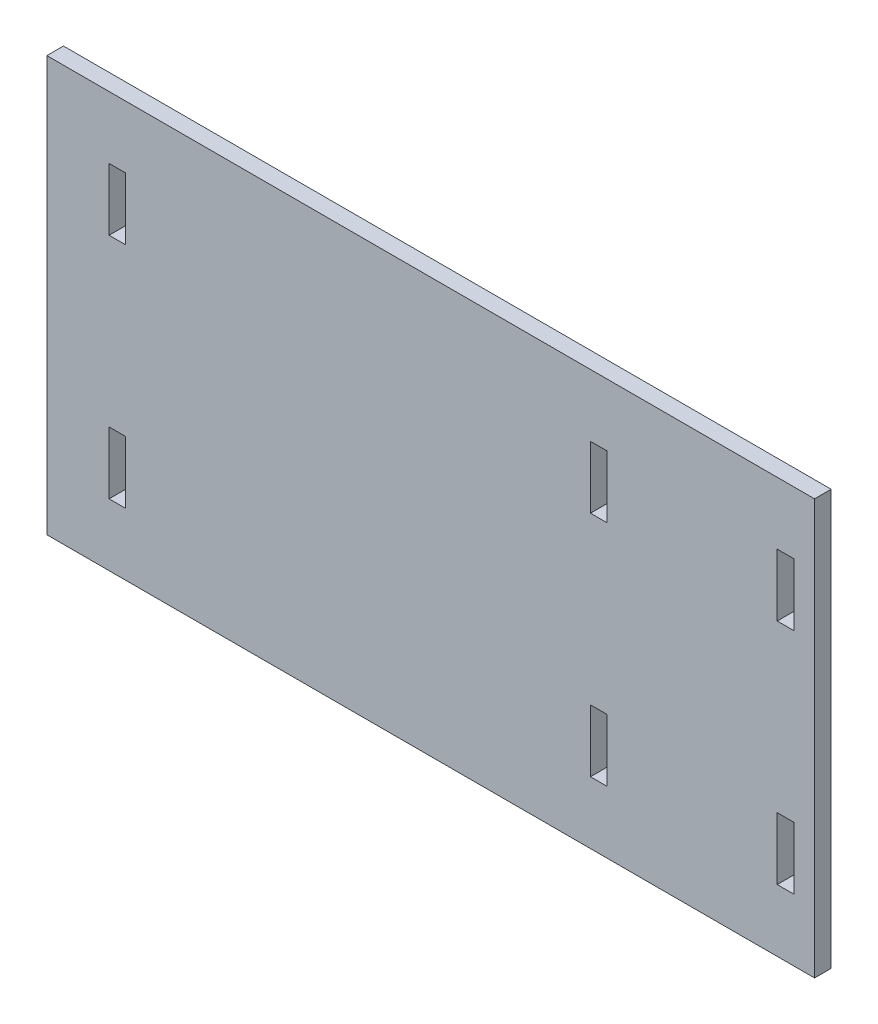
ISO-10303-21;
HEADER;
FILE_DESCRIPTION(('STEP AP214'),'2;1');
FILE_NAME('part.step','',(''),(''),'','','');
FILE_SCHEMA(('AUTOMOTIVE_DESIGN { 1 0 10303 214 1 1 1 1 }'));
ENDSEC;
DATA;
#1=APPLICATION_CONTEXT('core data for automotive mechanical design processes');
#2=APPLICATION_PROTOCOL_DEFINITION('international standard','automotive_design',2000,#1);
#3=PRODUCT_CONTEXT('',#1,'mechanical');
#4=PRODUCT('Part','Part','',(#3));
#5=PRODUCT_RELATED_PRODUCT_CATEGORY('part','',(#4));
#6=PRODUCT_DEFINITION_FORMATION('','',#4);
#7=PRODUCT_DEFINITION_CONTEXT('part definition',#1,'design');
#8=PRODUCT_DEFINITION('design','',#6,#7);
#9=PRODUCT_DEFINITION_SHAPE('','',#8);
#10=(LENGTH_UNIT() NAMED_UNIT(*) SI_UNIT(.MILLI.,.METRE.));
#11=(NAMED_UNIT(*) PLANE_ANGLE_UNIT() SI_UNIT($,.RADIAN.));
#12=(NAMED_UNIT(*) SI_UNIT($,.STERADIAN.) SOLID_ANGLE_UNIT());
#13=UNCERTAINTY_MEASURE_WITH_UNIT(LENGTH_MEASURE(1.E-05),#10,'distance_accuracy_value','');
#14=(GEOMETRIC_REPRESENTATION_CONTEXT(3) GLOBAL_UNCERTAINTY_ASSIGNED_CONTEXT((#13)) GLOBAL_UNIT_ASSIGNED_CONTEXT((#10,
#11,#12)) REPRESENTATION_CONTEXT('',''));
#15=CARTESIAN_POINT('',(0.,0.,0.));
#16=DIRECTION('',(0.,0.,1.));
#17=DIRECTION('',(1.,0.,0.));
#18=AXIS2_PLACEMENT_3D('',#15,#16,#17);
#19=CARTESIAN_POINT('',(0.,0.,4.));
#20=DIRECTION('',(0.,0.,-1.));
#21=DIRECTION('',(-1.,0.,0.));
#22=AXIS2_PLACEMENT_3D('',#19,#20,#21);
#23=PLANE('',#22);
#24=DIRECTION('',(0.,-1.,0.));
#25=VECTOR('',#24,1.);
#26=CARTESIAN_POINT('',(101.,35.,4.));
#27=LINE('',#26,#25);
#28=CARTESIAN_POINT('',(101.,35.,4.));
#29=VERTEX_POINT('',#28);
#30=CARTESIAN_POINT('',(101.,20.,4.));
#31=VERTEX_POINT('',#30);
#32=EDGE_CURVE('E253',#29,#31,#27,.T.);
#33=ORIENTED_EDGE('',*,*,#32,.F.);
#34=DIRECTION('',(-1.,0.,0.));
#35=VECTOR('',#34,1.);
#36=CARTESIAN_POINT('',(101.,35.,4.));
#37=LINE('',#36,#35);
#38=CARTESIAN_POINT('',(105.,35.,4.));
#39=VERTEX_POINT('',#38);
#40=EDGE_CURVE('E261',#39,#29,#37,.T.);
#41=ORIENTED_EDGE('',*,*,#40,.F.);
#42=DIRECTION('',(0.,1.,0.));
#43=VECTOR('',#42,1.);
#44=CARTESIAN_POINT('',(105.,35.,4.));
#45=LINE('',#44,#43);
#46=CARTESIAN_POINT('',(105.,20.,4.));
#47=VERTEX_POINT('',#46);
#48=EDGE_CURVE('E258',#47,#39,#45,.T.);
#49=ORIENTED_EDGE('',*,*,#48,.F.);
#50=DIRECTION('',(1.,0.,0.));
#51=VECTOR('',#50,1.);
#52=CARTESIAN_POINT('',(101.,20.,4.));
#53=LINE('',#52,#51);
#54=EDGE_CURVE('E255',#31,#47,#53,.T.);
#55=ORIENTED_EDGE('',*,*,#54,.F.);
#56=EDGE_LOOP('',(#33,#41,#49,#55));
#57=FACE_BOUND('',#56,.T.);
#58=DIRECTION('',(0.,1.,0.));
#59=VECTOR('',#58,1.);
#60=CARTESIAN_POINT('',(-56.0000000000003,35.,4.));
#61=LINE('',#60,#59);
#62=CARTESIAN_POINT('',(-56.0000000000003,20.,4.));
#63=VERTEX_POINT('',#62);
#64=CARTESIAN_POINT('',(-56.0000000000003,35.,4.));
#65=VERTEX_POINT('',#64);
#66=EDGE_CURVE('E315',#63,#65,#61,.T.);
#67=ORIENTED_EDGE('',*,*,#66,.F.);
#68=DIRECTION('',(1.,0.,0.));
#69=VECTOR('',#68,1.);
#70=CARTESIAN_POINT('',(-56.0000000000003,20.,4.));
#71=LINE('',#70,#69);
#72=CARTESIAN_POINT('',(-60.0000000000003,20.,4.));
#73=VERTEX_POINT('',#72);
#74=EDGE_CURVE('E323',#73,#63,#71,.T.);
#75=ORIENTED_EDGE('',*,*,#74,.F.);
#76=DIRECTION('',(0.,-1.,0.));
#77=VECTOR('',#76,1.);
#78=CARTESIAN_POINT('',(-60.0000000000003,35.,4.));
#79=LINE('',#78,#77);
#80=CARTESIAN_POINT('',(-60.0000000000003,35.,4.));
#81=VERTEX_POINT('',#80);
#82=EDGE_CURVE('E320',#81,#73,#79,.T.);
#83=ORIENTED_EDGE('',*,*,#82,.F.);
#84=DIRECTION('',(-1.,0.,0.));
#85=VECTOR('',#84,1.);
#86=CARTESIAN_POINT('',(-56.0000000000003,35.,4.));
#87=LINE('',#86,#85);
#88=EDGE_CURVE('E317',#65,#81,#87,.T.);
#89=ORIENTED_EDGE('',*,*,#88,.F.);
#90=EDGE_LOOP('',(#67,#75,#83,#89));
#91=FACE_BOUND('',#90,.T.);
#92=DIRECTION('',(0.,-1.,0.));
#93=VECTOR('',#92,1.);
#94=CARTESIAN_POINT('',(56.0000000000003,35.,4.));
#95=LINE('',#94,#93);
#96=CARTESIAN_POINT('',(56.0000000000003,35.,4.));
#97=VERTEX_POINT('',#96);
#98=CARTESIAN_POINT('',(56.0000000000003,20.,4.));
#99=VERTEX_POINT('',#98);
#100=EDGE_CURVE('E377',#97,#99,#95,.T.);
#101=ORIENTED_EDGE('',*,*,#100,.F.);
#102=DIRECTION('',(-1.,0.,0.));
#103=VECTOR('',#102,1.);
#104=CARTESIAN_POINT('',(56.0000000000003,35.,4.));
#105=LINE('',#104,#103);
#106=CARTESIAN_POINT('',(60.0000000000003,35.,4.));
#107=VERTEX_POINT('',#106);
#108=EDGE_CURVE('E385',#107,#97,#105,.T.);
#109=ORIENTED_EDGE('',*,*,#108,.F.);
#110=DIRECTION('',(0.,1.,0.));
#111=VECTOR('',#110,1.);
#112=CARTESIAN_POINT('',(60.0000000000003,35.,4.));
#113=LINE('',#112,#111);
#114=CARTESIAN_POINT('',(60.0000000000003,20.,4.));
#115=VERTEX_POINT('',#114);
#116=EDGE_CURVE('E382',#115,#107,#113,.T.);
#117=ORIENTED_EDGE('',*,*,#116,.F.);
#118=DIRECTION('',(1.,0.,0.));
#119=VECTOR('',#118,1.);
#120=CARTESIAN_POINT('',(56.0000000000003,20.,4.));
#121=LINE('',#120,#119);
#122=EDGE_CURVE('E379',#99,#115,#121,.T.);
#123=ORIENTED_EDGE('',*,*,#122,.F.);
#124=EDGE_LOOP('',(#101,#109,#117,#123));
#125=FACE_BOUND('',#124,.T.);
#126=DIRECTION('',(-1.,0.,0.));
#127=VECTOR('',#126,1.);
#128=CARTESIAN_POINT('',(75.0000000000003,50.,4.));
#129=LINE('',#128,#127);
#130=CARTESIAN_POINT('',(110.,50.,4.));
#131=VERTEX_POINT('',#130);
#132=CARTESIAN_POINT('',(-74.9999999999998,50.,4.));
#133=VERTEX_POINT('',#132);
#134=EDGE_CURVE('E408',#131,#133,#129,.T.);
#135=ORIENTED_EDGE('',*,*,#134,.T.);
#136=DIRECTION('',(0.,-1.,0.));
#137=VECTOR('',#136,1.);
#138=CARTESIAN_POINT('',(-75.0000000000004,-50.,4.));
#139=LINE('',#138,#137);
#140=CARTESIAN_POINT('',(-75.0000000000004,-50.,4.));
#141=VERTEX_POINT('',#140);
#142=EDGE_CURVE('E410',#133,#141,#139,.T.);
#143=ORIENTED_EDGE('',*,*,#142,.T.);
#144=DIRECTION('',(1.,0.,0.));
#145=VECTOR('',#144,1.);
#146=CARTESIAN_POINT('',(-75.0000000000004,-50.,4.));
#147=LINE('',#146,#145);
#148=CARTESIAN_POINT('',(110.,-50.,4.));
#149=VERTEX_POINT('',#148);
#150=EDGE_CURVE('E413',#141,#149,#147,.T.);
#151=ORIENTED_EDGE('',*,*,#150,.T.);
#152=DIRECTION('',(0.,1.,0.));
#153=VECTOR('',#152,1.);
#154=CARTESIAN_POINT('',(110.,50.,4.));
#155=LINE('',#154,#153);
#156=EDGE_CURVE('E415',#149,#131,#155,.T.);
#157=ORIENTED_EDGE('',*,*,#156,.T.);
#158=EDGE_LOOP('',(#135,#143,#151,#157));
#159=FACE_BOUND('',#158,.T.);
#160=DIRECTION('',(0.,-1.,0.));
#161=VECTOR('',#160,1.);
#162=CARTESIAN_POINT('',(56.0000000000003,-35.,4.));
#163=LINE('',#162,#161);
#164=CARTESIAN_POINT('',(56.0000000000003,-20.,4.));
#165=VERTEX_POINT('',#164);
#166=CARTESIAN_POINT('',(56.0000000000003,-35.,4.));
#167=VERTEX_POINT('',#166);
#168=EDGE_CURVE('E346',#165,#167,#163,.T.);
#169=ORIENTED_EDGE('',*,*,#168,.F.);
#170=DIRECTION('',(-1.,0.,0.));
#171=VECTOR('',#170,1.);
#172=CARTESIAN_POINT('',(56.0000000000003,-20.,4.));
#173=LINE('',#172,#171);
#174=CARTESIAN_POINT('',(60.0000000000003,-20.,4.));
#175=VERTEX_POINT('',#174);
#176=EDGE_CURVE('E354',#175,#165,#173,.T.);
#177=ORIENTED_EDGE('',*,*,#176,.F.);
#178=DIRECTION('',(0.,1.,0.));
#179=VECTOR('',#178,1.);
#180=CARTESIAN_POINT('',(60.0000000000003,-35.,4.));
#181=LINE('',#180,#179);
#182=CARTESIAN_POINT('',(60.0000000000003,-35.,4.));
#183=VERTEX_POINT('',#182);
#184=EDGE_CURVE('E351',#183,#175,#181,.T.);
#185=ORIENTED_EDGE('',*,*,#184,.F.);
#186=DIRECTION('',(1.,0.,0.));
#187=VECTOR('',#186,1.);
#188=CARTESIAN_POINT('',(56.0000000000003,-35.,4.));
#189=LINE('',#188,#187);
#190=EDGE_CURVE('E348',#167,#183,#189,.T.);
#191=ORIENTED_EDGE('',*,*,#190,.F.);
#192=EDGE_LOOP('',(#169,#177,#185,#191));
#193=FACE_BOUND('',#192,.T.);
#194=DIRECTION('',(0.,1.,0.));
#195=VECTOR('',#194,1.);
#196=CARTESIAN_POINT('',(-56.0000000000003,-35.,4.));
#197=LINE('',#196,#195);
#198=CARTESIAN_POINT('',(-56.0000000000003,-35.,4.));
#199=VERTEX_POINT('',#198);
#200=CARTESIAN_POINT('',(-56.0000000000003,-20.,4.));
#201=VERTEX_POINT('',#200);
#202=EDGE_CURVE('E284',#199,#201,#197,.T.);
#203=ORIENTED_EDGE('',*,*,#202,.F.);
#204=DIRECTION('',(1.,0.,0.));
#205=VECTOR('',#204,1.);
#206=CARTESIAN_POINT('',(-56.0000000000003,-35.,4.));
#207=LINE('',#206,#205);
#208=CARTESIAN_POINT('',(-60.0000000000003,-35.,4.));
#209=VERTEX_POINT('',#208);
#210=EDGE_CURVE('E292',#209,#199,#207,.T.);
#211=ORIENTED_EDGE('',*,*,#210,.F.);
#212=DIRECTION('',(0.,-1.,0.));
#213=VECTOR('',#212,1.);
#214=CARTESIAN_POINT('',(-60.0000000000003,-35.,4.));
#215=LINE('',#214,#213);
#216=CARTESIAN_POINT('',(-60.0000000000003,-20.,4.));
#217=VERTEX_POINT('',#216);
#218=EDGE_CURVE('E289',#217,#209,#215,.T.);
#219=ORIENTED_EDGE('',*,*,#218,.F.);
#220=DIRECTION('',(-1.,0.,0.));
#221=VECTOR('',#220,1.);
#222=CARTESIAN_POINT('',(-56.0000000000003,-20.,4.));
#223=LINE('',#222,#221);
#224=EDGE_CURVE('E286',#201,#217,#223,.T.);
#225=ORIENTED_EDGE('',*,*,#224,.F.);
#226=EDGE_LOOP('',(#203,#211,#219,#225));
#227=FACE_BOUND('',#226,.T.);
#228=DIRECTION('',(0.,-1.,0.));
#229=VECTOR('',#228,1.);
#230=CARTESIAN_POINT('',(101.,-20.,4.));
#231=LINE('',#230,#229);
#232=CARTESIAN_POINT('',(101.,-20.,4.));
#233=VERTEX_POINT('',#232);
#234=CARTESIAN_POINT('',(101.,-34.9999999999999,4.));
#235=VERTEX_POINT('',#234);
#236=EDGE_CURVE('E217',#233,#235,#231,.T.);
#237=ORIENTED_EDGE('',*,*,#236,.F.);
#238=DIRECTION('',(-1.,0.,0.));
#239=VECTOR('',#238,1.);
#240=CARTESIAN_POINT('',(101.,-20.,4.));
#241=LINE('',#240,#239);
#242=CARTESIAN_POINT('',(105.,-20.,4.));
#243=VERTEX_POINT('',#242);
#244=EDGE_CURVE('E239',#243,#233,#241,.T.);
#245=ORIENTED_EDGE('',*,*,#244,.F.);
#246=DIRECTION('',(0.,1.,0.));
#247=VECTOR('',#246,1.);
#248=CARTESIAN_POINT('',(105.,-20.,4.));
#249=LINE('',#248,#247);
#250=CARTESIAN_POINT('',(105.,-34.9999999999999,4.));
#251=VERTEX_POINT('',#250);
#252=EDGE_CURVE('E237',#251,#243,#249,.T.);
#253=ORIENTED_EDGE('',*,*,#252,.F.);
#254=DIRECTION('',(1.,0.,0.));
#255=VECTOR('',#254,1.);
#256=CARTESIAN_POINT('',(101.,-34.9999999999999,4.));
#257=LINE('',#256,#255);
#258=EDGE_CURVE('E225',#235,#251,#257,.T.);
#259=ORIENTED_EDGE('',*,*,#258,.F.);
#260=EDGE_LOOP('',(#237,#245,#253,#259));
#261=FACE_BOUND('',#260,.T.);
#262=ADVANCED_FACE('F32',(#57,#91,#125,#159,#193,#227,#261),#23,.F.);
#263=CARTESIAN_POINT('',(0.,0.,0.));
#264=DIRECTION('',(0.,0.,-1.));
#265=DIRECTION('',(-1.,0.,0.));
#266=AXIS2_PLACEMENT_3D('',#263,#264,#265);
#267=PLANE('',#266);
#268=DIRECTION('',(-1.,0.,0.));
#269=VECTOR('',#268,1.);
#270=CARTESIAN_POINT('',(-74.9999999999998,50.,0.));
#271=LINE('',#270,#269);
#272=CARTESIAN_POINT('',(110.,50.,0.));
#273=VERTEX_POINT('',#272);
#274=CARTESIAN_POINT('',(-74.9999999999998,50.,0.));
#275=VERTEX_POINT('',#274);
#276=EDGE_CURVE('E407',#273,#275,#271,.T.);
#277=ORIENTED_EDGE('',*,*,#276,.F.);
#278=DIRECTION('',(0.,1.,0.));
#279=VECTOR('',#278,1.);
#280=CARTESIAN_POINT('',(110.,50.,0.));
#281=LINE('',#280,#279);
#282=CARTESIAN_POINT('',(110.,-50.,0.));
#283=VERTEX_POINT('',#282);
#284=EDGE_CURVE('E411',#283,#273,#281,.T.);
#285=ORIENTED_EDGE('',*,*,#284,.F.);
#286=DIRECTION('',(1.,0.,0.));
#287=VECTOR('',#286,1.);
#288=CARTESIAN_POINT('',(110.,-50.,0.));
#289=LINE('',#288,#287);
#290=CARTESIAN_POINT('',(-75.0000000000004,-50.,0.));
#291=VERTEX_POINT('',#290);
#292=EDGE_CURVE('E422',#291,#283,#289,.T.);
#293=ORIENTED_EDGE('',*,*,#292,.F.);
#294=DIRECTION('',(0.,-1.,0.));
#295=VECTOR('',#294,1.);
#296=CARTESIAN_POINT('',(-75.0000000000004,-50.,0.));
#297=LINE('',#296,#295);
#298=EDGE_CURVE('E419',#275,#291,#297,.T.);
#299=ORIENTED_EDGE('',*,*,#298,.F.);
#300=EDGE_LOOP('',(#277,#285,#293,#299));
#301=FACE_BOUND('',#300,.T.);
#302=DIRECTION('',(-1.,0.,0.));
#303=VECTOR('',#302,1.);
#304=CARTESIAN_POINT('',(56.0000000000003,35.,0.));
#305=LINE('',#304,#303);
#306=CARTESIAN_POINT('',(60.0000000000003,35.,0.));
#307=VERTEX_POINT('',#306);
#308=CARTESIAN_POINT('',(56.0000000000003,35.,0.));
#309=VERTEX_POINT('',#308);
#310=EDGE_CURVE('E380',#307,#309,#305,.T.);
#311=ORIENTED_EDGE('',*,*,#310,.T.);
#312=DIRECTION('',(0.,-1.,0.));
#313=VECTOR('',#312,1.);
#314=CARTESIAN_POINT('',(56.0000000000003,35.,0.));
#315=LINE('',#314,#313);
#316=CARTESIAN_POINT('',(56.0000000000003,20.,0.));
#317=VERTEX_POINT('',#316);
#318=EDGE_CURVE('E376',#309,#317,#315,.T.);
#319=ORIENTED_EDGE('',*,*,#318,.T.);
#320=DIRECTION('',(1.,0.,0.));
#321=VECTOR('',#320,1.);
#322=CARTESIAN_POINT('',(56.0000000000003,20.,0.));
#323=LINE('',#322,#321);
#324=CARTESIAN_POINT('',(60.0000000000003,20.,0.));
#325=VERTEX_POINT('',#324);
#326=EDGE_CURVE('E390',#317,#325,#323,.T.);
#327=ORIENTED_EDGE('',*,*,#326,.T.);
#328=DIRECTION('',(0.,1.,0.));
#329=VECTOR('',#328,1.);
#330=CARTESIAN_POINT('',(60.0000000000003,35.,0.));
#331=LINE('',#330,#329);
#332=EDGE_CURVE('E393',#325,#307,#331,.T.);
#333=ORIENTED_EDGE('',*,*,#332,.T.);
#334=EDGE_LOOP('',(#311,#319,#327,#333));
#335=FACE_BOUND('',#334,.T.);
#336=DIRECTION('',(-1.,0.,0.));
#337=VECTOR('',#336,1.);
#338=CARTESIAN_POINT('',(56.0000000000003,-20.,0.));
#339=LINE('',#338,#337);
#340=CARTESIAN_POINT('',(60.0000000000003,-20.,0.));
#341=VERTEX_POINT('',#340);
#342=CARTESIAN_POINT('',(56.0000000000003,-20.,0.));
#343=VERTEX_POINT('',#342);
#344=EDGE_CURVE('E349',#341,#343,#339,.T.);
#345=ORIENTED_EDGE('',*,*,#344,.T.);
#346=DIRECTION('',(0.,-1.,0.));
#347=VECTOR('',#346,1.);
#348=CARTESIAN_POINT('',(56.0000000000003,-35.,0.));
#349=LINE('',#348,#347);
#350=CARTESIAN_POINT('',(56.0000000000003,-35.,0.));
#351=VERTEX_POINT('',#350);
#352=EDGE_CURVE('E345',#343,#351,#349,.T.);
#353=ORIENTED_EDGE('',*,*,#352,.T.);
#354=DIRECTION('',(1.,0.,0.));
#355=VECTOR('',#354,1.);
#356=CARTESIAN_POINT('',(56.0000000000003,-35.,0.));
#357=LINE('',#356,#355);
#358=CARTESIAN_POINT('',(60.0000000000003,-35.,0.));
#359=VERTEX_POINT('',#358);
#360=EDGE_CURVE('E359',#351,#359,#357,.T.);
#361=ORIENTED_EDGE('',*,*,#360,.T.);
#362=DIRECTION('',(0.,1.,0.));
#363=VECTOR('',#362,1.);
#364=CARTESIAN_POINT('',(60.0000000000003,-35.,0.));
#365=LINE('',#364,#363);
#366=EDGE_CURVE('E362',#359,#341,#365,.T.);
#367=ORIENTED_EDGE('',*,*,#366,.T.);
#368=EDGE_LOOP('',(#345,#353,#361,#367));
#369=FACE_BOUND('',#368,.T.);
#370=DIRECTION('',(1.,0.,0.));
#371=VECTOR('',#370,1.);
#372=CARTESIAN_POINT('',(-56.0000000000003,20.,0.));
#373=LINE('',#372,#371);
#374=CARTESIAN_POINT('',(-60.0000000000003,20.,0.));
#375=VERTEX_POINT('',#374);
#376=CARTESIAN_POINT('',(-56.0000000000003,20.,0.));
#377=VERTEX_POINT('',#376);
#378=EDGE_CURVE('E318',#375,#377,#373,.T.);
#379=ORIENTED_EDGE('',*,*,#378,.T.);
#380=DIRECTION('',(0.,1.,0.));
#381=VECTOR('',#380,1.);
#382=CARTESIAN_POINT('',(-56.0000000000003,35.,0.));
#383=LINE('',#382,#381);
#384=CARTESIAN_POINT('',(-56.0000000000003,35.,0.));
#385=VERTEX_POINT('',#384);
#386=EDGE_CURVE('E314',#377,#385,#383,.T.);
#387=ORIENTED_EDGE('',*,*,#386,.T.);
#388=DIRECTION('',(-1.,0.,0.));
#389=VECTOR('',#388,1.);
#390=CARTESIAN_POINT('',(-56.0000000000003,35.,0.));
#391=LINE('',#390,#389);
#392=CARTESIAN_POINT('',(-60.0000000000003,35.,0.));
#393=VERTEX_POINT('',#392);
#394=EDGE_CURVE('E328',#385,#393,#391,.T.);
#395=ORIENTED_EDGE('',*,*,#394,.T.);
#396=DIRECTION('',(0.,-1.,0.));
#397=VECTOR('',#396,1.);
#398=CARTESIAN_POINT('',(-60.0000000000003,35.,0.));
#399=LINE('',#398,#397);
#400=EDGE_CURVE('E331',#393,#375,#399,.T.);
#401=ORIENTED_EDGE('',*,*,#400,.T.);
#402=EDGE_LOOP('',(#379,#387,#395,#401));
#403=FACE_BOUND('',#402,.T.);
#404=DIRECTION('',(1.,0.,0.));
#405=VECTOR('',#404,1.);
#406=CARTESIAN_POINT('',(-56.0000000000003,-35.,0.));
#407=LINE('',#406,#405);
#408=CARTESIAN_POINT('',(-60.0000000000003,-35.,0.));
#409=VERTEX_POINT('',#408);
#410=CARTESIAN_POINT('',(-56.0000000000003,-35.,0.));
#411=VERTEX_POINT('',#410);
#412=EDGE_CURVE('E287',#409,#411,#407,.T.);
#413=ORIENTED_EDGE('',*,*,#412,.T.);
#414=DIRECTION('',(0.,1.,0.));
#415=VECTOR('',#414,1.);
#416=CARTESIAN_POINT('',(-56.0000000000003,-35.,0.));
#417=LINE('',#416,#415);
#418=CARTESIAN_POINT('',(-56.0000000000003,-20.,0.));
#419=VERTEX_POINT('',#418);
#420=EDGE_CURVE('E283',#411,#419,#417,.T.);
#421=ORIENTED_EDGE('',*,*,#420,.T.);
#422=DIRECTION('',(-1.,0.,0.));
#423=VECTOR('',#422,1.);
#424=CARTESIAN_POINT('',(-56.0000000000003,-20.,0.));
#425=LINE('',#424,#423);
#426=CARTESIAN_POINT('',(-60.0000000000003,-20.,0.));
#427=VERTEX_POINT('',#426);
#428=EDGE_CURVE('E297',#419,#427,#425,.T.);
#429=ORIENTED_EDGE('',*,*,#428,.T.);
#430=DIRECTION('',(0.,-1.,0.));
#431=VECTOR('',#430,1.);
#432=CARTESIAN_POINT('',(-60.0000000000003,-35.,0.));
#433=LINE('',#432,#431);
#434=EDGE_CURVE('E300',#427,#409,#433,.T.);
#435=ORIENTED_EDGE('',*,*,#434,.T.);
#436=EDGE_LOOP('',(#413,#421,#429,#435));
#437=FACE_BOUND('',#436,.T.);
#438=DIRECTION('',(-1.,0.,0.));
#439=VECTOR('',#438,1.);
#440=CARTESIAN_POINT('',(101.,35.,0.));
#441=LINE('',#440,#439);
#442=CARTESIAN_POINT('',(105.,35.,0.));
#443=VERTEX_POINT('',#442);
#444=CARTESIAN_POINT('',(101.,35.,0.));
#445=VERTEX_POINT('',#444);
#446=EDGE_CURVE('E256',#443,#445,#441,.T.);
#447=ORIENTED_EDGE('',*,*,#446,.T.);
#448=DIRECTION('',(0.,-1.,0.));
#449=VECTOR('',#448,1.);
#450=CARTESIAN_POINT('',(101.,35.,0.));
#451=LINE('',#450,#449);
#452=CARTESIAN_POINT('',(101.,20.,0.));
#453=VERTEX_POINT('',#452);
#454=EDGE_CURVE('E233',#445,#453,#451,.T.);
#455=ORIENTED_EDGE('',*,*,#454,.T.);
#456=DIRECTION('',(1.,0.,0.));
#457=VECTOR('',#456,1.);
#458=CARTESIAN_POINT('',(101.,20.,0.));
#459=LINE('',#458,#457);
#460=CARTESIAN_POINT('',(105.,20.,0.));
#461=VERTEX_POINT('',#460);
#462=EDGE_CURVE('E266',#453,#461,#459,.T.);
#463=ORIENTED_EDGE('',*,*,#462,.T.);
#464=DIRECTION('',(0.,1.,0.));
#465=VECTOR('',#464,1.);
#466=CARTESIAN_POINT('',(105.,35.,0.));
#467=LINE('',#466,#465);
#468=EDGE_CURVE('E269',#461,#443,#467,.T.);
#469=ORIENTED_EDGE('',*,*,#468,.T.);
#470=EDGE_LOOP('',(#447,#455,#463,#469));
#471=FACE_BOUND('',#470,.T.);
#472=DIRECTION('',(-1.,0.,0.));
#473=VECTOR('',#472,1.);
#474=CARTESIAN_POINT('',(101.,-20.,0.));
#475=LINE('',#474,#473);
#476=CARTESIAN_POINT('',(105.,-20.,0.));
#477=VERTEX_POINT('',#476);
#478=CARTESIAN_POINT('',(101.,-20.,0.));
#479=VERTEX_POINT('',#478);
#480=EDGE_CURVE('E226',#477,#479,#475,.T.);
#481=ORIENTED_EDGE('',*,*,#480,.T.);
#482=DIRECTION('',(0.,-1.,0.));
#483=VECTOR('',#482,1.);
#484=CARTESIAN_POINT('',(101.,-20.,0.));
#485=LINE('',#484,#483);
#486=CARTESIAN_POINT('',(101.,-34.9999999999999,0.));
#487=VERTEX_POINT('',#486);
#488=EDGE_CURVE('E55',#479,#487,#485,.T.);
#489=ORIENTED_EDGE('',*,*,#488,.T.);
#490=DIRECTION('',(1.,0.,0.));
#491=VECTOR('',#490,1.);
#492=CARTESIAN_POINT('',(101.,-34.9999999999999,0.));
#493=LINE('',#492,#491);
#494=CARTESIAN_POINT('',(105.,-34.9999999999999,0.));
#495=VERTEX_POINT('',#494);
#496=EDGE_CURVE('E232',#487,#495,#493,.T.);
#497=ORIENTED_EDGE('',*,*,#496,.T.);
#498=DIRECTION('',(0.,1.,0.));
#499=VECTOR('',#498,1.);
#500=CARTESIAN_POINT('',(105.,-20.,0.));
#501=LINE('',#500,#499);
#502=EDGE_CURVE('E245',#495,#477,#501,.T.);
#503=ORIENTED_EDGE('',*,*,#502,.T.);
#504=EDGE_LOOP('',(#481,#489,#497,#503));
#505=FACE_BOUND('',#504,.T.);
#506=ADVANCED_FACE('F442',(#301,#335,#369,#403,#437,#471,#505),#267,.T.);
#507=CARTESIAN_POINT('',(-74.9999999999998,50.,4.));
#508=DIRECTION('',(0.,-1.,0.));
#509=DIRECTION('',(0.,0.,-1.));
#510=AXIS2_PLACEMENT_3D('',#507,#508,#509);
#511=PLANE('',#510);
#512=ORIENTED_EDGE('',*,*,#276,.T.);
#513=DIRECTION('',(0.,0.,-1.));
#514=VECTOR('',#513,1.);
#515=CARTESIAN_POINT('',(-74.9999999999998,50.,4.));
#516=LINE('',#515,#514);
#517=EDGE_CURVE('E11',#133,#275,#516,.T.);
#518=ORIENTED_EDGE('',*,*,#517,.F.);
#519=ORIENTED_EDGE('',*,*,#134,.F.);
#520=DIRECTION('',(0.,0.,-1.));
#521=VECTOR('',#520,1.);
#522=CARTESIAN_POINT('',(110.,50.,4.));
#523=LINE('',#522,#521);
#524=EDGE_CURVE('E417',#131,#273,#523,.T.);
#525=ORIENTED_EDGE('',*,*,#524,.T.);
#526=EDGE_LOOP('',(#512,#518,#519,#525));
#527=FACE_BOUND('',#526,.T.);
#528=ADVANCED_FACE('F34',(#527),#511,.F.);
#529=CARTESIAN_POINT('',(-75.0000000000004,-50.,4.));
#530=DIRECTION('',(1.,0.,0.));
#531=DIRECTION('',(0.,1.,0.));
#532=AXIS2_PLACEMENT_3D('',#529,#530,#531);
#533=PLANE('',#532);
#534=ORIENTED_EDGE('',*,*,#298,.T.);
#535=DIRECTION('',(0.,0.,-1.));
#536=VECTOR('',#535,1.);
#537=CARTESIAN_POINT('',(-75.0000000000004,-50.,4.));
#538=LINE('',#537,#536);
#539=EDGE_CURVE('E40',#141,#291,#538,.T.);
#540=ORIENTED_EDGE('',*,*,#539,.F.);
#541=ORIENTED_EDGE('',*,*,#142,.F.);
#542=ORIENTED_EDGE('',*,*,#517,.T.);
#543=EDGE_LOOP('',(#534,#540,#541,#542));
#544=FACE_BOUND('',#543,.T.);
#545=ADVANCED_FACE('F438',(#544),#533,.F.);
#546=CARTESIAN_POINT('',(110.,-50.,4.));
#547=DIRECTION('',(0.,1.,0.));
#548=DIRECTION('',(-1.,0.,0.));
#549=AXIS2_PLACEMENT_3D('',#546,#547,#548);
#550=PLANE('',#549);
#551=ORIENTED_EDGE('',*,*,#292,.T.);
#552=DIRECTION('',(0.,0.,-1.));
#553=VECTOR('',#552,1.);
#554=CARTESIAN_POINT('',(110.,-50.,4.));
#555=LINE('',#554,#553);
#556=EDGE_CURVE('E428',#149,#283,#555,.T.);
#557=ORIENTED_EDGE('',*,*,#556,.F.);
#558=ORIENTED_EDGE('',*,*,#150,.F.);
#559=ORIENTED_EDGE('',*,*,#539,.T.);
#560=EDGE_LOOP('',(#551,#557,#558,#559));
#561=FACE_BOUND('',#560,.T.);
#562=ADVANCED_FACE('F434',(#561),#550,.F.);
#563=CARTESIAN_POINT('',(110.,50.,4.));
#564=DIRECTION('',(-1.,0.,0.));
#565=DIRECTION('',(0.,-1.,0.));
#566=AXIS2_PLACEMENT_3D('',#563,#564,#565);
#567=PLANE('',#566);
#568=ORIENTED_EDGE('',*,*,#284,.T.);
#569=ORIENTED_EDGE('',*,*,#524,.F.);
#570=ORIENTED_EDGE('',*,*,#156,.F.);
#571=ORIENTED_EDGE('',*,*,#556,.T.);
#572=EDGE_LOOP('',(#568,#569,#570,#571));
#573=FACE_BOUND('',#572,.T.);
#574=ADVANCED_FACE('F447',(#573),#567,.F.);
#575=CARTESIAN_POINT('',(56.0000000000003,35.,4.));
#576=DIRECTION('',(1.,0.,0.));
#577=DIRECTION('',(0.,0.,-1.));
#578=AXIS2_PLACEMENT_3D('',#575,#576,#577);
#579=PLANE('',#578);
#580=ORIENTED_EDGE('',*,*,#318,.F.);
#581=DIRECTION('',(0.,0.,-1.));
#582=VECTOR('',#581,1.);
#583=CARTESIAN_POINT('',(56.0000000000003,35.,4.));
#584=LINE('',#583,#582);
#585=EDGE_CURVE('E387',#97,#309,#584,.T.);
#586=ORIENTED_EDGE('',*,*,#585,.F.);
#587=ORIENTED_EDGE('',*,*,#100,.T.);
#588=DIRECTION('',(0.,0.,-1.));
#589=VECTOR('',#588,1.);
#590=CARTESIAN_POINT('',(56.0000000000003,20.,4.));
#591=LINE('',#590,#589);
#592=EDGE_CURVE('E404',#99,#317,#591,.T.);
#593=ORIENTED_EDGE('',*,*,#592,.T.);
#594=EDGE_LOOP('',(#580,#586,#587,#593));
#595=FACE_BOUND('',#594,.T.);
#596=ADVANCED_FACE('F535',(#595),#579,.T.);
#597=CARTESIAN_POINT('',(56.0000000000003,20.,4.));
#598=DIRECTION('',(0.,1.,0.));
#599=DIRECTION('',(0.,0.,1.));
#600=AXIS2_PLACEMENT_3D('',#597,#598,#599);
#601=PLANE('',#600);
#602=ORIENTED_EDGE('',*,*,#326,.F.);
#603=ORIENTED_EDGE('',*,*,#592,.F.);
#604=ORIENTED_EDGE('',*,*,#122,.T.);
#605=DIRECTION('',(0.,0.,-1.));
#606=VECTOR('',#605,1.);
#607=CARTESIAN_POINT('',(60.0000000000003,20.,4.));
#608=LINE('',#607,#606);
#609=EDGE_CURVE('E402',#115,#325,#608,.T.);
#610=ORIENTED_EDGE('',*,*,#609,.T.);
#611=EDGE_LOOP('',(#602,#603,#604,#610));
#612=FACE_BOUND('',#611,.T.);
#613=ADVANCED_FACE('F531',(#612),#601,.T.);
#614=CARTESIAN_POINT('',(60.0000000000003,35.,4.));
#615=DIRECTION('',(-1.,0.,0.));
#616=DIRECTION('',(0.,0.,1.));
#617=AXIS2_PLACEMENT_3D('',#614,#615,#616);
#618=PLANE('',#617);
#619=ORIENTED_EDGE('',*,*,#332,.F.);
#620=ORIENTED_EDGE('',*,*,#609,.F.);
#621=ORIENTED_EDGE('',*,*,#116,.T.);
#622=DIRECTION('',(0.,0.,-1.));
#623=VECTOR('',#622,1.);
#624=CARTESIAN_POINT('',(60.0000000000003,35.,4.));
#625=LINE('',#624,#623);
#626=EDGE_CURVE('E400',#107,#307,#625,.T.);
#627=ORIENTED_EDGE('',*,*,#626,.T.);
#628=EDGE_LOOP('',(#619,#620,#621,#627));
#629=FACE_BOUND('',#628,.T.);
#630=ADVANCED_FACE('F527',(#629),#618,.T.);
#631=CARTESIAN_POINT('',(56.0000000000003,35.,4.));
#632=DIRECTION('',(0.,-1.,0.));
#633=DIRECTION('',(0.,0.,-1.));
#634=AXIS2_PLACEMENT_3D('',#631,#632,#633);
#635=PLANE('',#634);
#636=ORIENTED_EDGE('',*,*,#310,.F.);
#637=ORIENTED_EDGE('',*,*,#626,.F.);
#638=ORIENTED_EDGE('',*,*,#108,.T.);
#639=ORIENTED_EDGE('',*,*,#585,.T.);
#640=EDGE_LOOP('',(#636,#637,#638,#639));
#641=FACE_BOUND('',#640,.T.);
#642=ADVANCED_FACE('F523',(#641),#635,.T.);
#643=CARTESIAN_POINT('',(56.0000000000003,-35.,4.));
#644=DIRECTION('',(1.,0.,0.));
#645=DIRECTION('',(0.,0.,-1.));
#646=AXIS2_PLACEMENT_3D('',#643,#644,#645);
#647=PLANE('',#646);
#648=ORIENTED_EDGE('',*,*,#352,.F.);
#649=DIRECTION('',(0.,0.,-1.));
#650=VECTOR('',#649,1.);
#651=CARTESIAN_POINT('',(56.0000000000003,-20.,4.));
#652=LINE('',#651,#650);
#653=EDGE_CURVE('E356',#165,#343,#652,.T.);
#654=ORIENTED_EDGE('',*,*,#653,.F.);
#655=ORIENTED_EDGE('',*,*,#168,.T.);
#656=DIRECTION('',(0.,0.,-1.));
#657=VECTOR('',#656,1.);
#658=CARTESIAN_POINT('',(56.0000000000003,-35.,4.));
#659=LINE('',#658,#657);
#660=EDGE_CURVE('E373',#167,#351,#659,.T.);
#661=ORIENTED_EDGE('',*,*,#660,.T.);
#662=EDGE_LOOP('',(#648,#654,#655,#661));
#663=FACE_BOUND('',#662,.T.);
#664=ADVANCED_FACE('F519',(#663),#647,.T.);
#665=CARTESIAN_POINT('',(56.0000000000003,-35.,4.));
#666=DIRECTION('',(0.,1.,0.));
#667=DIRECTION('',(0.,0.,1.));
#668=AXIS2_PLACEMENT_3D('',#665,#666,#667);
#669=PLANE('',#668);
#670=ORIENTED_EDGE('',*,*,#360,.F.);
#671=ORIENTED_EDGE('',*,*,#660,.F.);
#672=ORIENTED_EDGE('',*,*,#190,.T.);
#673=DIRECTION('',(0.,0.,-1.));
#674=VECTOR('',#673,1.);
#675=CARTESIAN_POINT('',(60.0000000000003,-35.,4.));
#676=LINE('',#675,#674);
#677=EDGE_CURVE('E371',#183,#359,#676,.T.);
#678=ORIENTED_EDGE('',*,*,#677,.T.);
#679=EDGE_LOOP('',(#670,#671,#672,#678));
#680=FACE_BOUND('',#679,.T.);
#681=ADVANCED_FACE('F515',(#680),#669,.T.);
#682=CARTESIAN_POINT('',(60.0000000000003,-35.,4.));
#683=DIRECTION('',(-1.,0.,0.));
#684=DIRECTION('',(0.,0.,1.));
#685=AXIS2_PLACEMENT_3D('',#682,#683,#684);
#686=PLANE('',#685);
#687=ORIENTED_EDGE('',*,*,#366,.F.);
#688=ORIENTED_EDGE('',*,*,#677,.F.);
#689=ORIENTED_EDGE('',*,*,#184,.T.);
#690=DIRECTION('',(0.,0.,-1.));
#691=VECTOR('',#690,1.);
#692=CARTESIAN_POINT('',(60.0000000000003,-20.,4.));
#693=LINE('',#692,#691);
#694=EDGE_CURVE('E369',#175,#341,#693,.T.);
#695=ORIENTED_EDGE('',*,*,#694,.T.);
#696=EDGE_LOOP('',(#687,#688,#689,#695));
#697=FACE_BOUND('',#696,.T.);
#698=ADVANCED_FACE('F511',(#697),#686,.T.);
#699=CARTESIAN_POINT('',(56.0000000000003,-20.,4.));
#700=DIRECTION('',(0.,-1.,0.));
#701=DIRECTION('',(0.,0.,-1.));
#702=AXIS2_PLACEMENT_3D('',#699,#700,#701);
#703=PLANE('',#702);
#704=ORIENTED_EDGE('',*,*,#344,.F.);
#705=ORIENTED_EDGE('',*,*,#694,.F.);
#706=ORIENTED_EDGE('',*,*,#176,.T.);
#707=ORIENTED_EDGE('',*,*,#653,.T.);
#708=EDGE_LOOP('',(#704,#705,#706,#707));
#709=FACE_BOUND('',#708,.T.);
#710=ADVANCED_FACE('F507',(#709),#703,.T.);
#711=CARTESIAN_POINT('',(-56.0000000000003,35.,4.));
#712=DIRECTION('',(-1.,0.,0.));
#713=DIRECTION('',(0.,0.,1.));
#714=AXIS2_PLACEMENT_3D('',#711,#712,#713);
#715=PLANE('',#714);
#716=ORIENTED_EDGE('',*,*,#386,.F.);
#717=DIRECTION('',(0.,0.,-1.));
#718=VECTOR('',#717,1.);
#719=CARTESIAN_POINT('',(-56.0000000000003,20.,4.));
#720=LINE('',#719,#718);
#721=EDGE_CURVE('E325',#63,#377,#720,.T.);
#722=ORIENTED_EDGE('',*,*,#721,.F.);
#723=ORIENTED_EDGE('',*,*,#66,.T.);
#724=DIRECTION('',(0.,0.,-1.));
#725=VECTOR('',#724,1.);
#726=CARTESIAN_POINT('',(-56.0000000000003,35.,4.));
#727=LINE('',#726,#725);
#728=EDGE_CURVE('E342',#65,#385,#727,.T.);
#729=ORIENTED_EDGE('',*,*,#728,.T.);
#730=EDGE_LOOP('',(#716,#722,#723,#729));
#731=FACE_BOUND('',#730,.T.);
#732=ADVANCED_FACE('F503',(#731),#715,.T.);
#733=CARTESIAN_POINT('',(-56.0000000000003,35.,4.));
#734=DIRECTION('',(0.,-1.,0.));
#735=DIRECTION('',(0.,0.,-1.));
#736=AXIS2_PLACEMENT_3D('',#733,#734,#735);
#737=PLANE('',#736);
#738=ORIENTED_EDGE('',*,*,#394,.F.);
#739=ORIENTED_EDGE('',*,*,#728,.F.);
#740=ORIENTED_EDGE('',*,*,#88,.T.);
#741=DIRECTION('',(0.,0.,-1.));
#742=VECTOR('',#741,1.);
#743=CARTESIAN_POINT('',(-60.0000000000003,35.,4.));
#744=LINE('',#743,#742);
#745=EDGE_CURVE('E340',#81,#393,#744,.T.);
#746=ORIENTED_EDGE('',*,*,#745,.T.);
#747=EDGE_LOOP('',(#738,#739,#740,#746));
#748=FACE_BOUND('',#747,.T.);
#749=ADVANCED_FACE('F499',(#748),#737,.T.);
#750=CARTESIAN_POINT('',(-60.0000000000003,35.,4.));
#751=DIRECTION('',(1.,0.,0.));
#752=DIRECTION('',(0.,0.,-1.));
#753=AXIS2_PLACEMENT_3D('',#750,#751,#752);
#754=PLANE('',#753);
#755=ORIENTED_EDGE('',*,*,#400,.F.);
#756=ORIENTED_EDGE('',*,*,#745,.F.);
#757=ORIENTED_EDGE('',*,*,#82,.T.);
#758=DIRECTION('',(0.,0.,-1.));
#759=VECTOR('',#758,1.);
#760=CARTESIAN_POINT('',(-60.0000000000003,20.,4.));
#761=LINE('',#760,#759);
#762=EDGE_CURVE('E338',#73,#375,#761,.T.);
#763=ORIENTED_EDGE('',*,*,#762,.T.);
#764=EDGE_LOOP('',(#755,#756,#757,#763));
#765=FACE_BOUND('',#764,.T.);
#766=ADVANCED_FACE('F495',(#765),#754,.T.);
#767=CARTESIAN_POINT('',(-56.0000000000003,20.,4.));
#768=DIRECTION('',(0.,1.,0.));
#769=DIRECTION('',(0.,0.,1.));
#770=AXIS2_PLACEMENT_3D('',#767,#768,#769);
#771=PLANE('',#770);
#772=ORIENTED_EDGE('',*,*,#378,.F.);
#773=ORIENTED_EDGE('',*,*,#762,.F.);
#774=ORIENTED_EDGE('',*,*,#74,.T.);
#775=ORIENTED_EDGE('',*,*,#721,.T.);
#776=EDGE_LOOP('',(#772,#773,#774,#775));
#777=FACE_BOUND('',#776,.T.);
#778=ADVANCED_FACE('F492',(#777),#771,.T.);
#779=CARTESIAN_POINT('',(-56.0000000000003,-35.,4.));
#780=DIRECTION('',(-1.,0.,0.));
#781=DIRECTION('',(0.,0.,1.));
#782=AXIS2_PLACEMENT_3D('',#779,#780,#781);
#783=PLANE('',#782);
#784=ORIENTED_EDGE('',*,*,#420,.F.);
#785=DIRECTION('',(0.,0.,-1.));
#786=VECTOR('',#785,1.);
#787=CARTESIAN_POINT('',(-56.0000000000003,-35.,4.));
#788=LINE('',#787,#786);
#789=EDGE_CURVE('E294',#199,#411,#788,.T.);
#790=ORIENTED_EDGE('',*,*,#789,.F.);
#791=ORIENTED_EDGE('',*,*,#202,.T.);
#792=DIRECTION('',(0.,0.,-1.));
#793=VECTOR('',#792,1.);
#794=CARTESIAN_POINT('',(-56.0000000000003,-20.,4.));
#795=LINE('',#794,#793);
#796=EDGE_CURVE('E311',#201,#419,#795,.T.);
#797=ORIENTED_EDGE('',*,*,#796,.T.);
#798=EDGE_LOOP('',(#784,#790,#791,#797));
#799=FACE_BOUND('',#798,.T.);
#800=ADVANCED_FACE('F467',(#799),#783,.T.);
#801=CARTESIAN_POINT('',(-56.0000000000003,-20.,4.));
#802=DIRECTION('',(0.,-1.,0.));
#803=DIRECTION('',(0.,0.,-1.));
#804=AXIS2_PLACEMENT_3D('',#801,#802,#803);
#805=PLANE('',#804);
#806=ORIENTED_EDGE('',*,*,#428,.F.);
#807=ORIENTED_EDGE('',*,*,#796,.F.);
#808=ORIENTED_EDGE('',*,*,#224,.T.);
#809=DIRECTION('',(0.,0.,-1.));
#810=VECTOR('',#809,1.);
#811=CARTESIAN_POINT('',(-60.0000000000003,-20.,4.));
#812=LINE('',#811,#810);
#813=EDGE_CURVE('E309',#217,#427,#812,.T.);
#814=ORIENTED_EDGE('',*,*,#813,.T.);
#815=EDGE_LOOP('',(#806,#807,#808,#814));
#816=FACE_BOUND('',#815,.T.);
#817=ADVANCED_FACE('F469',(#816),#805,.T.);
#818=CARTESIAN_POINT('',(-60.0000000000003,-35.,4.));
#819=DIRECTION('',(1.,0.,0.));
#820=DIRECTION('',(0.,0.,-1.));
#821=AXIS2_PLACEMENT_3D('',#818,#819,#820);
#822=PLANE('',#821);
#823=ORIENTED_EDGE('',*,*,#434,.F.);
#824=ORIENTED_EDGE('',*,*,#813,.F.);
#825=ORIENTED_EDGE('',*,*,#218,.T.);
#826=DIRECTION('',(0.,0.,-1.));
#827=VECTOR('',#826,1.);
#828=CARTESIAN_POINT('',(-60.0000000000003,-35.,4.));
#829=LINE('',#828,#827);
#830=EDGE_CURVE('E307',#209,#409,#829,.T.);
#831=ORIENTED_EDGE('',*,*,#830,.T.);
#832=EDGE_LOOP('',(#823,#824,#825,#831));
#833=FACE_BOUND('',#832,.T.);
#834=ADVANCED_FACE('F478',(#833),#822,.T.);
#835=CARTESIAN_POINT('',(-56.0000000000003,-35.,4.));
#836=DIRECTION('',(0.,1.,0.));
#837=DIRECTION('',(0.,0.,1.));
#838=AXIS2_PLACEMENT_3D('',#835,#836,#837);
#839=PLANE('',#838);
#840=ORIENTED_EDGE('',*,*,#412,.F.);
#841=ORIENTED_EDGE('',*,*,#830,.F.);
#842=ORIENTED_EDGE('',*,*,#210,.T.);
#843=ORIENTED_EDGE('',*,*,#789,.T.);
#844=EDGE_LOOP('',(#840,#841,#842,#843));
#845=FACE_BOUND('',#844,.T.);
#846=ADVANCED_FACE('F476',(#845),#839,.T.);
#847=CARTESIAN_POINT('',(101.,35.,4.));
#848=DIRECTION('',(1.,0.,0.));
#849=DIRECTION('',(0.,1.,0.));
#850=AXIS2_PLACEMENT_3D('',#847,#848,#849);
#851=PLANE('',#850);
#852=ORIENTED_EDGE('',*,*,#454,.F.);
#853=DIRECTION('',(0.,0.,-1.));
#854=VECTOR('',#853,1.);
#855=CARTESIAN_POINT('',(101.,35.,4.));
#856=LINE('',#855,#854);
#857=EDGE_CURVE('E263',#29,#445,#856,.T.);
#858=ORIENTED_EDGE('',*,*,#857,.F.);
#859=ORIENTED_EDGE('',*,*,#32,.T.);
#860=DIRECTION('',(0.,0.,-1.));
#861=VECTOR('',#860,1.);
#862=CARTESIAN_POINT('',(101.,20.,4.));
#863=LINE('',#862,#861);
#864=EDGE_CURVE('E280',#31,#453,#863,.T.);
#865=ORIENTED_EDGE('',*,*,#864,.T.);
#866=EDGE_LOOP('',(#852,#858,#859,#865));
#867=FACE_BOUND('',#866,.T.);
#868=ADVANCED_FACE('F485',(#867),#851,.T.);
#869=CARTESIAN_POINT('',(101.,20.,4.));
#870=DIRECTION('',(0.,1.,0.));
#871=DIRECTION('',(-1.,0.,0.));
#872=AXIS2_PLACEMENT_3D('',#869,#870,#871);
#873=PLANE('',#872);
#874=ORIENTED_EDGE('',*,*,#462,.F.);
#875=ORIENTED_EDGE('',*,*,#864,.F.);
#876=ORIENTED_EDGE('',*,*,#54,.T.);
#877=DIRECTION('',(0.,0.,-1.));
#878=VECTOR('',#877,1.);
#879=CARTESIAN_POINT('',(105.,20.,4.));
#880=LINE('',#879,#878);
#881=EDGE_CURVE('E278',#47,#461,#880,.T.);
#882=ORIENTED_EDGE('',*,*,#881,.T.);
#883=EDGE_LOOP('',(#874,#875,#876,#882));
#884=FACE_BOUND('',#883,.T.);
#885=ADVANCED_FACE('F672',(#884),#873,.T.);
#886=CARTESIAN_POINT('',(105.,35.,4.));
#887=DIRECTION('',(-1.,0.,0.));
#888=DIRECTION('',(0.,-1.,0.));
#889=AXIS2_PLACEMENT_3D('',#886,#887,#888);
#890=PLANE('',#889);
#891=ORIENTED_EDGE('',*,*,#468,.F.);
#892=ORIENTED_EDGE('',*,*,#881,.F.);
#893=ORIENTED_EDGE('',*,*,#48,.T.);
#894=DIRECTION('',(0.,0.,-1.));
#895=VECTOR('',#894,1.);
#896=CARTESIAN_POINT('',(105.,35.,4.));
#897=LINE('',#896,#895);
#898=EDGE_CURVE('E276',#39,#443,#897,.T.);
#899=ORIENTED_EDGE('',*,*,#898,.T.);
#900=EDGE_LOOP('',(#891,#892,#893,#899));
#901=FACE_BOUND('',#900,.T.);
#902=ADVANCED_FACE('F680',(#901),#890,.T.);
#903=CARTESIAN_POINT('',(101.,35.,4.));
#904=DIRECTION('',(0.,-1.,0.));
#905=DIRECTION('',(0.,0.,-1.));
#906=AXIS2_PLACEMENT_3D('',#903,#904,#905);
#907=PLANE('',#906);
#908=ORIENTED_EDGE('',*,*,#446,.F.);
#909=ORIENTED_EDGE('',*,*,#898,.F.);
#910=ORIENTED_EDGE('',*,*,#40,.T.);
#911=ORIENTED_EDGE('',*,*,#857,.T.);
#912=EDGE_LOOP('',(#908,#909,#910,#911));
#913=FACE_BOUND('',#912,.T.);
#914=ADVANCED_FACE('F689',(#913),#907,.T.);
#915=CARTESIAN_POINT('',(101.,-20.,4.));
#916=DIRECTION('',(1.,0.,0.));
#917=DIRECTION('',(0.,0.,-1.));
#918=AXIS2_PLACEMENT_3D('',#915,#916,#917);
#919=PLANE('',#918);
#920=ORIENTED_EDGE('',*,*,#488,.F.);
#921=DIRECTION('',(0.,0.,-1.));
#922=VECTOR('',#921,1.);
#923=CARTESIAN_POINT('',(101.,-20.,4.));
#924=LINE('',#923,#922);
#925=EDGE_CURVE('E221',#233,#479,#924,.T.);
#926=ORIENTED_EDGE('',*,*,#925,.F.);
#927=ORIENTED_EDGE('',*,*,#236,.T.);
#928=DIRECTION('',(0.,0.,-1.));
#929=VECTOR('',#928,1.);
#930=CARTESIAN_POINT('',(101.,-34.9999999999999,4.));
#931=LINE('',#930,#929);
#932=EDGE_CURVE('E220',#235,#487,#931,.T.);
#933=ORIENTED_EDGE('',*,*,#932,.T.);
#934=EDGE_LOOP('',(#920,#926,#927,#933));
#935=FACE_BOUND('',#934,.T.);
#936=ADVANCED_FACE('F219',(#935),#919,.T.);
#937=CARTESIAN_POINT('',(101.,-34.9999999999999,4.));
#938=DIRECTION('',(0.,1.,0.));
#939=DIRECTION('',(0.,0.,1.));
#940=AXIS2_PLACEMENT_3D('',#937,#938,#939);
#941=PLANE('',#940);
#942=ORIENTED_EDGE('',*,*,#496,.F.);
#943=ORIENTED_EDGE('',*,*,#932,.F.);
#944=ORIENTED_EDGE('',*,*,#258,.T.);
#945=DIRECTION('',(0.,0.,-1.));
#946=VECTOR('',#945,1.);
#947=CARTESIAN_POINT('',(105.,-34.9999999999999,4.));
#948=LINE('',#947,#946);
#949=EDGE_CURVE('E234',#251,#495,#948,.T.);
#950=ORIENTED_EDGE('',*,*,#949,.T.);
#951=EDGE_LOOP('',(#942,#943,#944,#950));
#952=FACE_BOUND('',#951,.T.);
#953=ADVANCED_FACE('F229',(#952),#941,.T.);
#954=CARTESIAN_POINT('',(105.,-20.,4.));
#955=DIRECTION('',(-1.,0.,0.));
#956=DIRECTION('',(0.,-1.,0.));
#957=AXIS2_PLACEMENT_3D('',#954,#955,#956);
#958=PLANE('',#957);
#959=ORIENTED_EDGE('',*,*,#502,.F.);
#960=ORIENTED_EDGE('',*,*,#949,.F.);
#961=ORIENTED_EDGE('',*,*,#252,.T.);
#962=DIRECTION('',(0.,0.,-1.));
#963=VECTOR('',#962,1.);
#964=CARTESIAN_POINT('',(105.,-20.,4.));
#965=LINE('',#964,#963);
#966=EDGE_CURVE('E47',#243,#477,#965,.T.);
#967=ORIENTED_EDGE('',*,*,#966,.T.);
#968=EDGE_LOOP('',(#959,#960,#961,#967));
#969=FACE_BOUND('',#968,.T.);
#970=ADVANCED_FACE('F713',(#969),#958,.T.);
#971=CARTESIAN_POINT('',(101.,-20.,4.));
#972=DIRECTION('',(0.,-1.,0.));
#973=DIRECTION('',(0.,0.,-1.));
#974=AXIS2_PLACEMENT_3D('',#971,#972,#973);
#975=PLANE('',#974);
#976=ORIENTED_EDGE('',*,*,#480,.F.);
#977=ORIENTED_EDGE('',*,*,#966,.F.);
#978=ORIENTED_EDGE('',*,*,#244,.T.);
#979=ORIENTED_EDGE('',*,*,#925,.T.);
#980=EDGE_LOOP('',(#976,#977,#978,#979));
#981=FACE_BOUND('',#980,.T.);
#982=ADVANCED_FACE('F721',(#981),#975,.T.);
#983=CLOSED_SHELL('',(#262,#506,#528,#545,#562,#574,#596,#613,#630,#642,#664,#681,#698,#710,
#732,#749,#766,#778,#800,#817,#834,#846,#868,#885,#902,#914,#936,#953,#970,#982));
#984=MANIFOLD_SOLID_BREP('B2',#983);
#985=ADVANCED_BREP_SHAPE_REPRESENTATION('',(#18,#984),#14);
#986=SHAPE_DEFINITION_REPRESENTATION(#9,#985);
ENDSEC;
END-ISO-10303-21;
